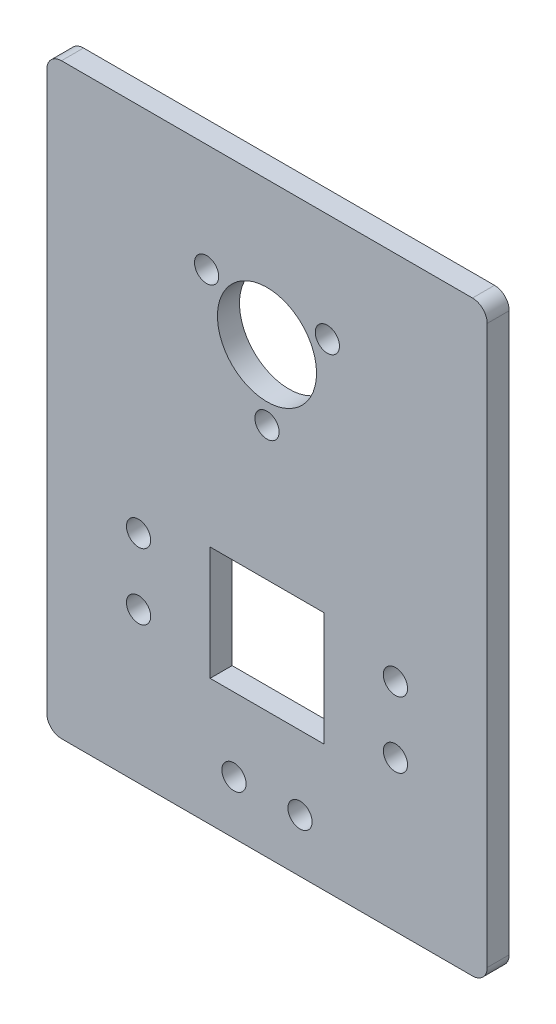
ISO-10303-21;
HEADER;
FILE_DESCRIPTION(('STEP AP214'),'2;1');
FILE_NAME('part.step','',(''),(''),'','','');
FILE_SCHEMA(('AUTOMOTIVE_DESIGN { 1 0 10303 214 1 1 1 1 }'));
ENDSEC;
DATA;
#1=APPLICATION_CONTEXT('core data for automotive mechanical design processes');
#2=APPLICATION_PROTOCOL_DEFINITION('international standard','automotive_design',2000,#1);
#3=PRODUCT_CONTEXT('',#1,'mechanical');
#4=PRODUCT('Part','Part','',(#3));
#5=PRODUCT_RELATED_PRODUCT_CATEGORY('part','',(#4));
#6=PRODUCT_DEFINITION_FORMATION('','',#4);
#7=PRODUCT_DEFINITION_CONTEXT('part definition',#1,'design');
#8=PRODUCT_DEFINITION('design','',#6,#7);
#9=PRODUCT_DEFINITION_SHAPE('','',#8);
#10=(LENGTH_UNIT() NAMED_UNIT(*) SI_UNIT(.MILLI.,.METRE.));
#11=(NAMED_UNIT(*) PLANE_ANGLE_UNIT() SI_UNIT($,.RADIAN.));
#12=(NAMED_UNIT(*) SI_UNIT($,.STERADIAN.) SOLID_ANGLE_UNIT());
#13=UNCERTAINTY_MEASURE_WITH_UNIT(LENGTH_MEASURE(1.E-05),#10,'distance_accuracy_value','');
#14=(GEOMETRIC_REPRESENTATION_CONTEXT(3) GLOBAL_UNCERTAINTY_ASSIGNED_CONTEXT((#13)) GLOBAL_UNIT_ASSIGNED_CONTEXT((#10,
#11,#12)) REPRESENTATION_CONTEXT('',''));
#15=CARTESIAN_POINT('',(0.,0.,0.));
#16=DIRECTION('',(0.,0.,1.));
#17=DIRECTION('',(1.,0.,0.));
#18=AXIS2_PLACEMENT_3D('',#15,#16,#17);
#19=CARTESIAN_POINT('',(0.,0.,3.));
#20=DIRECTION('',(0.,0.,-1.));
#21=DIRECTION('',(-1.,0.,0.));
#22=AXIS2_PLACEMENT_3D('',#19,#20,#21);
#23=PLANE('',#22);
#24=CARTESIAN_POINT('',(17.5,-14.5,3.));
#25=DIRECTION('',(0.,0.,1.));
#26=DIRECTION('',(1.,0.,0.));
#27=AXIS2_PLACEMENT_3D('',#24,#25,#26);
#28=CIRCLE('',#27,1.65);
#29=CARTESIAN_POINT('',(19.15,-14.5,3.));
#30=VERTEX_POINT('',#29);
#31=EDGE_CURVE('E501',#30,#30,#28,.T.);
#32=ORIENTED_EDGE('',*,*,#31,.F.);
#33=EDGE_LOOP('',(#32));
#34=FACE_BOUND('',#33,.T.);
#35=CARTESIAN_POINT('',(-17.5,-5.5,3.));
#36=DIRECTION('',(0.,0.,1.));
#37=DIRECTION('',(1.,0.,0.));
#38=AXIS2_PLACEMENT_3D('',#35,#36,#37);
#39=CIRCLE('',#38,1.65);
#40=CARTESIAN_POINT('',(-15.85,-5.5,3.));
#41=VERTEX_POINT('',#40);
#42=EDGE_CURVE('E505',#41,#41,#39,.T.);
#43=ORIENTED_EDGE('',*,*,#42,.F.);
#44=EDGE_LOOP('',(#43));
#45=FACE_BOUND('',#44,.T.);
#46=CARTESIAN_POINT('',(-17.5,-14.5,3.));
#47=DIRECTION('',(0.,0.,1.));
#48=DIRECTION('',(1.,0.,0.));
#49=AXIS2_PLACEMENT_3D('',#46,#47,#48);
#50=CIRCLE('',#49,1.65);
#51=CARTESIAN_POINT('',(-15.85,-14.5,3.));
#52=VERTEX_POINT('',#51);
#53=EDGE_CURVE('E506',#52,#52,#50,.T.);
#54=ORIENTED_EDGE('',*,*,#53,.F.);
#55=EDGE_LOOP('',(#54));
#56=FACE_BOUND('',#55,.T.);
#57=CARTESIAN_POINT('',(17.5,-5.5,3.));
#58=DIRECTION('',(0.,0.,1.));
#59=DIRECTION('',(1.,0.,0.));
#60=AXIS2_PLACEMENT_3D('',#57,#58,#59);
#61=CIRCLE('',#60,1.65);
#62=CARTESIAN_POINT('',(19.15,-5.5,3.));
#63=VERTEX_POINT('',#62);
#64=EDGE_CURVE('E247',#63,#63,#61,.T.);
#65=ORIENTED_EDGE('',*,*,#64,.F.);
#66=EDGE_LOOP('',(#65));
#67=FACE_BOUND('',#66,.T.);
#68=CARTESIAN_POINT('',(8.22724133595218,30.25,3.));
#69=DIRECTION('',(0.,0.,1.));
#70=DIRECTION('',(1.,0.,0.));
#71=AXIS2_PLACEMENT_3D('',#68,#69,#70);
#72=CIRCLE('',#71,1.65);
#73=CARTESIAN_POINT('',(9.87724133595218,30.25,3.));
#74=VERTEX_POINT('',#73);
#75=EDGE_CURVE('E185',#74,#74,#72,.T.);
#76=ORIENTED_EDGE('',*,*,#75,.F.);
#77=EDGE_LOOP('',(#76));
#78=FACE_BOUND('',#77,.T.);
#79=CARTESIAN_POINT('',(-8.22724133595216,30.25,3.));
#80=DIRECTION('',(0.,0.,1.));
#81=DIRECTION('',(1.,0.,0.));
#82=AXIS2_PLACEMENT_3D('',#79,#80,#81);
#83=CIRCLE('',#82,1.65);
#84=CARTESIAN_POINT('',(-6.57724133595216,30.25,3.));
#85=VERTEX_POINT('',#84);
#86=EDGE_CURVE('E176',#85,#85,#83,.T.);
#87=ORIENTED_EDGE('',*,*,#86,.F.);
#88=EDGE_LOOP('',(#87));
#89=FACE_BOUND('',#88,.T.);
#90=CARTESIAN_POINT('',(0.,16.,3.));
#91=DIRECTION('',(0.,0.,1.));
#92=DIRECTION('',(1.,0.,0.));
#93=AXIS2_PLACEMENT_3D('',#90,#91,#92);
#94=CIRCLE('',#93,1.65);
#95=CARTESIAN_POINT('',(1.65000000000001,16.,3.));
#96=VERTEX_POINT('',#95);
#97=EDGE_CURVE('E173',#96,#96,#94,.T.);
#98=ORIENTED_EDGE('',*,*,#97,.F.);
#99=EDGE_LOOP('',(#98));
#100=FACE_BOUND('',#99,.T.);
#101=DIRECTION('',(-1.,0.,0.));
#102=VECTOR('',#101,1.);
#103=CARTESIAN_POINT('',(-7.75,-2.25,3.));
#104=LINE('',#103,#102);
#105=CARTESIAN_POINT('',(7.75,-2.25,3.));
#106=VERTEX_POINT('',#105);
#107=CARTESIAN_POINT('',(-7.75,-2.25,3.));
#108=VERTEX_POINT('',#107);
#109=EDGE_CURVE('E149',#106,#108,#104,.T.);
#110=ORIENTED_EDGE('',*,*,#109,.F.);
#111=DIRECTION('',(0.,1.,0.));
#112=VECTOR('',#111,1.);
#113=CARTESIAN_POINT('',(7.75,-2.25,3.));
#114=LINE('',#113,#112);
#115=CARTESIAN_POINT('',(7.75,-17.75,3.));
#116=VERTEX_POINT('',#115);
#117=EDGE_CURVE('E154',#116,#106,#114,.T.);
#118=ORIENTED_EDGE('',*,*,#117,.F.);
#119=DIRECTION('',(1.,0.,0.));
#120=VECTOR('',#119,1.);
#121=CARTESIAN_POINT('',(-7.75,-17.75,3.));
#122=LINE('',#121,#120);
#123=CARTESIAN_POINT('',(-7.75,-17.75,3.));
#124=VERTEX_POINT('',#123);
#125=EDGE_CURVE('E158',#124,#116,#122,.T.);
#126=ORIENTED_EDGE('',*,*,#125,.F.);
#127=DIRECTION('',(0.,-1.,0.));
#128=VECTOR('',#127,1.);
#129=CARTESIAN_POINT('',(-7.75,-2.25,3.));
#130=LINE('',#129,#128);
#131=EDGE_CURVE('E138',#108,#124,#130,.T.);
#132=ORIENTED_EDGE('',*,*,#131,.F.);
#133=EDGE_LOOP('',(#110,#118,#126,#132));
#134=FACE_BOUND('',#133,.T.);
#135=CARTESIAN_POINT('',(-4.49999999999999,-27.75,3.));
#136=DIRECTION('',(0.,0.,1.));
#137=DIRECTION('',(1.,0.,0.));
#138=AXIS2_PLACEMENT_3D('',#135,#136,#137);
#139=CIRCLE('',#138,1.65);
#140=CARTESIAN_POINT('',(-2.84999999999999,-27.75,3.));
#141=VERTEX_POINT('',#140);
#142=EDGE_CURVE('E276',#141,#141,#139,.T.);
#143=ORIENTED_EDGE('',*,*,#142,.F.);
#144=EDGE_LOOP('',(#143));
#145=FACE_BOUND('',#144,.T.);
#146=CARTESIAN_POINT('',(4.50000000000001,-27.75,3.));
#147=DIRECTION('',(0.,0.,1.));
#148=DIRECTION('',(1.,0.,0.));
#149=AXIS2_PLACEMENT_3D('',#146,#147,#148);
#150=CIRCLE('',#149,1.65);
#151=CARTESIAN_POINT('',(6.15000000000001,-27.75,3.));
#152=VERTEX_POINT('',#151);
#153=EDGE_CURVE('E271',#152,#152,#150,.T.);
#154=ORIENTED_EDGE('',*,*,#153,.F.);
#155=EDGE_LOOP('',(#154));
#156=FACE_BOUND('',#155,.T.);
#157=CARTESIAN_POINT('',(0.,25.5,3.));
#158=DIRECTION('',(0.,0.,1.));
#159=DIRECTION('',(1.,0.,0.));
#160=AXIS2_PLACEMENT_3D('',#157,#158,#159);
#161=CIRCLE('',#160,6.75);
#162=CARTESIAN_POINT('',(6.75000000000001,25.5,3.));
#163=VERTEX_POINT('',#162);
#164=EDGE_CURVE('E257',#163,#163,#161,.T.);
#165=ORIENTED_EDGE('',*,*,#164,.F.);
#166=EDGE_LOOP('',(#165));
#167=FACE_BOUND('',#166,.T.);
#168=DIRECTION('',(-1.,0.,0.));
#169=VECTOR('',#168,1.);
#170=CARTESIAN_POINT('',(-34.5555340551916,-35.,3.));
#171=LINE('',#170,#169);
#172=CARTESIAN_POINT('',(28.,-35.,3.));
#173=VERTEX_POINT('',#172);
#174=CARTESIAN_POINT('',(-28.,-35.,3.));
#175=VERTEX_POINT('',#174);
#176=EDGE_CURVE('E253',#173,#175,#171,.T.);
#177=ORIENTED_EDGE('',*,*,#176,.F.);
#178=CARTESIAN_POINT('',(28.,-33.,3.));
#179=DIRECTION('',(0.,0.,-1.));
#180=DIRECTION('',(-1.,0.,0.));
#181=AXIS2_PLACEMENT_3D('',#178,#179,#180);
#182=CIRCLE('',#181,2.);
#183=CARTESIAN_POINT('',(30.,-33.,3.));
#184=VERTEX_POINT('',#183);
#185=EDGE_CURVE('E55',#173,#184,#182,.F.);
#186=ORIENTED_EDGE('',*,*,#185,.T.);
#187=DIRECTION('',(0.,1.,0.));
#188=VECTOR('',#187,1.);
#189=CARTESIAN_POINT('',(30.,-45.,3.));
#190=LINE('',#189,#188);
#191=CARTESIAN_POINT('',(30.,43.,3.));
#192=VERTEX_POINT('',#191);
#193=EDGE_CURVE('E190',#184,#192,#190,.T.);
#194=ORIENTED_EDGE('',*,*,#193,.T.);
#195=CARTESIAN_POINT('',(28.,43.,3.));
#196=DIRECTION('',(0.,0.,-1.));
#197=DIRECTION('',(-1.,0.,0.));
#198=AXIS2_PLACEMENT_3D('',#195,#196,#197);
#199=CIRCLE('',#198,2.);
#200=CARTESIAN_POINT('',(28.,45.,3.));
#201=VERTEX_POINT('',#200);
#202=EDGE_CURVE('E222',#192,#201,#199,.F.);
#203=ORIENTED_EDGE('',*,*,#202,.T.);
#204=DIRECTION('',(-1.,0.,0.));
#205=VECTOR('',#204,1.);
#206=CARTESIAN_POINT('',(-30.,45.,3.));
#207=LINE('',#206,#205);
#208=CARTESIAN_POINT('',(-28.,45.,3.));
#209=VERTEX_POINT('',#208);
#210=EDGE_CURVE('E186',#201,#209,#207,.T.);
#211=ORIENTED_EDGE('',*,*,#210,.T.);
#212=CARTESIAN_POINT('',(-28.,43.,3.));
#213=DIRECTION('',(0.,0.,-1.));
#214=DIRECTION('',(-1.,0.,0.));
#215=AXIS2_PLACEMENT_3D('',#212,#213,#214);
#216=CIRCLE('',#215,2.);
#217=CARTESIAN_POINT('',(-30.,43.,3.));
#218=VERTEX_POINT('',#217);
#219=EDGE_CURVE('E221',#209,#218,#216,.F.);
#220=ORIENTED_EDGE('',*,*,#219,.T.);
#221=DIRECTION('',(0.,-1.,0.));
#222=VECTOR('',#221,1.);
#223=CARTESIAN_POINT('',(-30.,-45.,3.));
#224=LINE('',#223,#222);
#225=CARTESIAN_POINT('',(-30.,-33.,3.));
#226=VERTEX_POINT('',#225);
#227=EDGE_CURVE('E192',#218,#226,#224,.T.);
#228=ORIENTED_EDGE('',*,*,#227,.T.);
#229=CARTESIAN_POINT('',(-28.,-33.,3.));
#230=DIRECTION('',(0.,0.,-1.));
#231=DIRECTION('',(-1.,0.,0.));
#232=AXIS2_PLACEMENT_3D('',#229,#230,#231);
#233=CIRCLE('',#232,2.);
#234=EDGE_CURVE('E58',#226,#175,#233,.F.);
#235=ORIENTED_EDGE('',*,*,#234,.T.);
#236=EDGE_LOOP('',(#177,#186,#194,#203,#211,#220,#228,#235));
#237=FACE_BOUND('',#236,.T.);
#238=ADVANCED_FACE('F43',(#34,#45,#56,#67,#78,#89,#100,#134,#145,#156,#167,#237),#23,.F.);
#239=CARTESIAN_POINT('',(30.,-45.,3.));
#240=DIRECTION('',(-1.,0.,0.));
#241=DIRECTION('',(0.,0.,1.));
#242=AXIS2_PLACEMENT_3D('',#239,#240,#241);
#243=PLANE('',#242);
#244=ORIENTED_EDGE('',*,*,#193,.F.);
#245=DIRECTION('',(0.,0.,-1.));
#246=VECTOR('',#245,1.);
#247=CARTESIAN_POINT('',(30.,-33.,3.));
#248=LINE('',#247,#246);
#249=CARTESIAN_POINT('',(30.,-33.,0.));
#250=VERTEX_POINT('',#249);
#251=EDGE_CURVE('E233',#184,#250,#248,.T.);
#252=ORIENTED_EDGE('',*,*,#251,.T.);
#253=DIRECTION('',(0.,1.,0.));
#254=VECTOR('',#253,1.);
#255=CARTESIAN_POINT('',(30.,-45.,0.));
#256=LINE('',#255,#254);
#257=CARTESIAN_POINT('',(30.,43.,0.));
#258=VERTEX_POINT('',#257);
#259=EDGE_CURVE('E175',#250,#258,#256,.T.);
#260=ORIENTED_EDGE('',*,*,#259,.T.);
#261=DIRECTION('',(0.,0.,-1.));
#262=VECTOR('',#261,1.);
#263=CARTESIAN_POINT('',(30.,43.,3.));
#264=LINE('',#263,#262);
#265=EDGE_CURVE('E218',#258,#192,#264,.F.);
#266=ORIENTED_EDGE('',*,*,#265,.T.);
#267=EDGE_LOOP('',(#244,#252,#260,#266));
#268=FACE_BOUND('',#267,.T.);
#269=ADVANCED_FACE('F307',(#268),#243,.F.);
#270=CARTESIAN_POINT('',(-30.,45.,3.));
#271=DIRECTION('',(0.,-1.,0.));
#272=DIRECTION('',(0.,0.,-1.));
#273=AXIS2_PLACEMENT_3D('',#270,#271,#272);
#274=PLANE('',#273);
#275=ORIENTED_EDGE('',*,*,#210,.F.);
#276=DIRECTION('',(0.,0.,-1.));
#277=VECTOR('',#276,1.);
#278=CARTESIAN_POINT('',(28.,45.,3.));
#279=LINE('',#278,#277);
#280=CARTESIAN_POINT('',(28.,45.,0.));
#281=VERTEX_POINT('',#280);
#282=EDGE_CURVE('E208',#201,#281,#279,.T.);
#283=ORIENTED_EDGE('',*,*,#282,.T.);
#284=DIRECTION('',(-1.,0.,0.));
#285=VECTOR('',#284,1.);
#286=CARTESIAN_POINT('',(-30.,45.,0.));
#287=LINE('',#286,#285);
#288=CARTESIAN_POINT('',(-28.,45.,0.));
#289=VERTEX_POINT('',#288);
#290=EDGE_CURVE('E200',#281,#289,#287,.T.);
#291=ORIENTED_EDGE('',*,*,#290,.T.);
#292=DIRECTION('',(0.,0.,-1.));
#293=VECTOR('',#292,1.);
#294=CARTESIAN_POINT('',(-28.,45.,3.));
#295=LINE('',#294,#293);
#296=EDGE_CURVE('E206',#289,#209,#295,.F.);
#297=ORIENTED_EDGE('',*,*,#296,.T.);
#298=EDGE_LOOP('',(#275,#283,#291,#297));
#299=FACE_BOUND('',#298,.T.);
#300=ADVANCED_FACE('F331',(#299),#274,.F.);
#301=CARTESIAN_POINT('',(-30.,-45.,3.));
#302=DIRECTION('',(1.,0.,0.));
#303=DIRECTION('',(0.,0.,-1.));
#304=AXIS2_PLACEMENT_3D('',#301,#302,#303);
#305=PLANE('',#304);
#306=DIRECTION('',(0.,-1.,0.));
#307=VECTOR('',#306,1.);
#308=CARTESIAN_POINT('',(-30.,-45.,0.));
#309=LINE('',#308,#307);
#310=CARTESIAN_POINT('',(-30.,43.,0.));
#311=VERTEX_POINT('',#310);
#312=CARTESIAN_POINT('',(-30.,-33.,0.));
#313=VERTEX_POINT('',#312);
#314=EDGE_CURVE('E188',#311,#313,#309,.T.);
#315=ORIENTED_EDGE('',*,*,#314,.T.);
#316=DIRECTION('',(0.,0.,1.));
#317=VECTOR('',#316,1.);
#318=CARTESIAN_POINT('',(-30.,-33.,3.));
#319=LINE('',#318,#317);
#320=EDGE_CURVE('E11',#313,#226,#319,.T.);
#321=ORIENTED_EDGE('',*,*,#320,.T.);
#322=ORIENTED_EDGE('',*,*,#227,.F.);
#323=DIRECTION('',(0.,0.,-1.));
#324=VECTOR('',#323,1.);
#325=CARTESIAN_POINT('',(-30.,43.,3.));
#326=LINE('',#325,#324);
#327=EDGE_CURVE('E224',#218,#311,#326,.T.);
#328=ORIENTED_EDGE('',*,*,#327,.T.);
#329=EDGE_LOOP('',(#315,#321,#322,#328));
#330=FACE_BOUND('',#329,.T.);
#331=ADVANCED_FACE('F292',(#330),#305,.F.);
#332=CARTESIAN_POINT('',(0.,0.,0.));
#333=DIRECTION('',(0.,0.,-1.));
#334=DIRECTION('',(-1.,0.,0.));
#335=AXIS2_PLACEMENT_3D('',#332,#333,#334);
#336=PLANE('',#335);
#337=CARTESIAN_POINT('',(17.5,-14.5,0.));
#338=DIRECTION('',(0.,0.,-1.));
#339=DIRECTION('',(-1.,0.,0.));
#340=AXIS2_PLACEMENT_3D('',#337,#338,#339);
#341=CIRCLE('',#340,1.65);
#342=CARTESIAN_POINT('',(15.85,-14.5,0.));
#343=VERTEX_POINT('',#342);
#344=EDGE_CURVE('E50',#343,#343,#341,.T.);
#345=ORIENTED_EDGE('',*,*,#344,.F.);
#346=EDGE_LOOP('',(#345));
#347=FACE_BOUND('',#346,.T.);
#348=CARTESIAN_POINT('',(-17.5,-5.5,0.));
#349=DIRECTION('',(0.,0.,-1.));
#350=DIRECTION('',(-1.,0.,0.));
#351=AXIS2_PLACEMENT_3D('',#348,#349,#350);
#352=CIRCLE('',#351,1.65);
#353=CARTESIAN_POINT('',(-19.15,-5.5,0.));
#354=VERTEX_POINT('',#353);
#355=EDGE_CURVE('E249',#354,#354,#352,.T.);
#356=ORIENTED_EDGE('',*,*,#355,.F.);
#357=EDGE_LOOP('',(#356));
#358=FACE_BOUND('',#357,.T.);
#359=CARTESIAN_POINT('',(-17.5,-14.5,0.));
#360=DIRECTION('',(0.,0.,-1.));
#361=DIRECTION('',(-1.,0.,0.));
#362=AXIS2_PLACEMENT_3D('',#359,#360,#361);
#363=CIRCLE('',#362,1.65);
#364=CARTESIAN_POINT('',(-19.15,-14.5,0.));
#365=VERTEX_POINT('',#364);
#366=EDGE_CURVE('E250',#365,#365,#363,.T.);
#367=ORIENTED_EDGE('',*,*,#366,.F.);
#368=EDGE_LOOP('',(#367));
#369=FACE_BOUND('',#368,.T.);
#370=CARTESIAN_POINT('',(17.5,-5.5,0.));
#371=DIRECTION('',(0.,0.,-1.));
#372=DIRECTION('',(-1.,0.,0.));
#373=AXIS2_PLACEMENT_3D('',#370,#371,#372);
#374=CIRCLE('',#373,1.65);
#375=CARTESIAN_POINT('',(15.85,-5.5,0.));
#376=VERTEX_POINT('',#375);
#377=EDGE_CURVE('E242',#376,#376,#374,.T.);
#378=ORIENTED_EDGE('',*,*,#377,.F.);
#379=EDGE_LOOP('',(#378));
#380=FACE_BOUND('',#379,.T.);
#381=ORIENTED_EDGE('',*,*,#259,.F.);
#382=CARTESIAN_POINT('',(28.,-33.,0.));
#383=DIRECTION('',(0.,0.,-1.));
#384=DIRECTION('',(-1.,0.,0.));
#385=AXIS2_PLACEMENT_3D('',#382,#383,#384);
#386=CIRCLE('',#385,2.);
#387=CARTESIAN_POINT('',(28.,-35.,0.));
#388=VERTEX_POINT('',#387);
#389=EDGE_CURVE('E236',#250,#388,#386,.T.);
#390=ORIENTED_EDGE('',*,*,#389,.T.);
#391=DIRECTION('',(1.,0.,0.));
#392=VECTOR('',#391,1.);
#393=CARTESIAN_POINT('',(0.,-35.,0.));
#394=LINE('',#393,#392);
#395=CARTESIAN_POINT('',(-28.,-35.,0.));
#396=VERTEX_POINT('',#395);
#397=EDGE_CURVE('E226',#396,#388,#394,.T.);
#398=ORIENTED_EDGE('',*,*,#397,.F.);
#399=CARTESIAN_POINT('',(-28.,-33.,0.));
#400=DIRECTION('',(0.,0.,-1.));
#401=DIRECTION('',(-1.,0.,0.));
#402=AXIS2_PLACEMENT_3D('',#399,#400,#401);
#403=CIRCLE('',#402,2.);
#404=EDGE_CURVE('E234',#396,#313,#403,.T.);
#405=ORIENTED_EDGE('',*,*,#404,.T.);
#406=ORIENTED_EDGE('',*,*,#314,.F.);
#407=CARTESIAN_POINT('',(-28.,43.,0.));
#408=DIRECTION('',(0.,0.,-1.));
#409=DIRECTION('',(-1.,0.,0.));
#410=AXIS2_PLACEMENT_3D('',#407,#408,#409);
#411=CIRCLE('',#410,2.);
#412=EDGE_CURVE('E212',#311,#289,#411,.T.);
#413=ORIENTED_EDGE('',*,*,#412,.T.);
#414=ORIENTED_EDGE('',*,*,#290,.F.);
#415=CARTESIAN_POINT('',(28.,43.,0.));
#416=DIRECTION('',(0.,0.,-1.));
#417=DIRECTION('',(-1.,0.,0.));
#418=AXIS2_PLACEMENT_3D('',#415,#416,#417);
#419=CIRCLE('',#418,2.);
#420=EDGE_CURVE('E214',#281,#258,#419,.T.);
#421=ORIENTED_EDGE('',*,*,#420,.T.);
#422=EDGE_LOOP('',(#381,#390,#398,#405,#406,#413,#414,#421));
#423=FACE_BOUND('',#422,.T.);
#424=CARTESIAN_POINT('',(0.,25.5,0.));
#425=DIRECTION('',(0.,0.,1.));
#426=DIRECTION('',(1.,0.,0.));
#427=AXIS2_PLACEMENT_3D('',#424,#425,#426);
#428=CIRCLE('',#427,6.75);
#429=CARTESIAN_POINT('',(6.75000000000001,25.5,0.));
#430=VERTEX_POINT('',#429);
#431=EDGE_CURVE('E265',#430,#430,#428,.T.);
#432=ORIENTED_EDGE('',*,*,#431,.T.);
#433=EDGE_LOOP('',(#432));
#434=FACE_BOUND('',#433,.T.);
#435=CARTESIAN_POINT('',(4.50000000000001,-27.75,0.));
#436=DIRECTION('',(0.,0.,1.));
#437=DIRECTION('',(1.,0.,0.));
#438=AXIS2_PLACEMENT_3D('',#435,#436,#437);
#439=CIRCLE('',#438,1.65);
#440=CARTESIAN_POINT('',(6.15000000000001,-27.75,0.));
#441=VERTEX_POINT('',#440);
#442=EDGE_CURVE('E269',#441,#441,#439,.T.);
#443=ORIENTED_EDGE('',*,*,#442,.T.);
#444=EDGE_LOOP('',(#443));
#445=FACE_BOUND('',#444,.T.);
#446=CARTESIAN_POINT('',(-4.49999999999999,-27.75,0.));
#447=DIRECTION('',(0.,0.,1.));
#448=DIRECTION('',(1.,0.,0.));
#449=AXIS2_PLACEMENT_3D('',#446,#447,#448);
#450=CIRCLE('',#449,1.65);
#451=CARTESIAN_POINT('',(-2.84999999999999,-27.75,0.));
#452=VERTEX_POINT('',#451);
#453=EDGE_CURVE('E267',#452,#452,#450,.T.);
#454=ORIENTED_EDGE('',*,*,#453,.T.);
#455=EDGE_LOOP('',(#454));
#456=FACE_BOUND('',#455,.T.);
#457=DIRECTION('',(0.,-1.,0.));
#458=VECTOR('',#457,1.);
#459=CARTESIAN_POINT('',(7.75,0.,0.));
#460=LINE('',#459,#458);
#461=CARTESIAN_POINT('',(7.75,-2.25,0.));
#462=VERTEX_POINT('',#461);
#463=CARTESIAN_POINT('',(7.75,-17.75,0.));
#464=VERTEX_POINT('',#463);
#465=EDGE_CURVE('E207',#462,#464,#460,.T.);
#466=ORIENTED_EDGE('',*,*,#465,.F.);
#467=DIRECTION('',(1.,0.,0.));
#468=VECTOR('',#467,1.);
#469=CARTESIAN_POINT('',(0.,-2.25,0.));
#470=LINE('',#469,#468);
#471=CARTESIAN_POINT('',(-7.75,-2.25,0.));
#472=VERTEX_POINT('',#471);
#473=EDGE_CURVE('E194',#472,#462,#470,.T.);
#474=ORIENTED_EDGE('',*,*,#473,.F.);
#475=DIRECTION('',(0.,1.,0.));
#476=VECTOR('',#475,1.);
#477=CARTESIAN_POINT('',(-7.75,0.,0.));
#478=LINE('',#477,#476);
#479=CARTESIAN_POINT('',(-7.75,-17.75,0.));
#480=VERTEX_POINT('',#479);
#481=EDGE_CURVE('E145',#480,#472,#478,.T.);
#482=ORIENTED_EDGE('',*,*,#481,.F.);
#483=DIRECTION('',(-1.,0.,0.));
#484=VECTOR('',#483,1.);
#485=CARTESIAN_POINT('',(0.,-17.75,0.));
#486=LINE('',#485,#484);
#487=EDGE_CURVE('E203',#464,#480,#486,.T.);
#488=ORIENTED_EDGE('',*,*,#487,.F.);
#489=EDGE_LOOP('',(#466,#474,#482,#488));
#490=FACE_BOUND('',#489,.T.);
#491=CARTESIAN_POINT('',(0.,16.,0.));
#492=DIRECTION('',(0.,0.,1.));
#493=DIRECTION('',(1.,0.,0.));
#494=AXIS2_PLACEMENT_3D('',#491,#492,#493);
#495=CIRCLE('',#494,1.65);
#496=CARTESIAN_POINT('',(1.65000000000001,16.,0.));
#497=VERTEX_POINT('',#496);
#498=EDGE_CURVE('E169',#497,#497,#495,.T.);
#499=ORIENTED_EDGE('',*,*,#498,.T.);
#500=EDGE_LOOP('',(#499));
#501=FACE_BOUND('',#500,.T.);
#502=CARTESIAN_POINT('',(-8.22724133595216,30.25,0.));
#503=DIRECTION('',(0.,0.,1.));
#504=DIRECTION('',(1.,0.,0.));
#505=AXIS2_PLACEMENT_3D('',#502,#503,#504);
#506=CIRCLE('',#505,1.65);
#507=CARTESIAN_POINT('',(-6.57724133595216,30.25,0.));
#508=VERTEX_POINT('',#507);
#509=EDGE_CURVE('E177',#508,#508,#506,.T.);
#510=ORIENTED_EDGE('',*,*,#509,.T.);
#511=EDGE_LOOP('',(#510));
#512=FACE_BOUND('',#511,.T.);
#513=CARTESIAN_POINT('',(8.22724133595218,30.25,0.));
#514=DIRECTION('',(0.,0.,1.));
#515=DIRECTION('',(1.,0.,0.));
#516=AXIS2_PLACEMENT_3D('',#513,#514,#515);
#517=CIRCLE('',#516,1.65);
#518=CARTESIAN_POINT('',(9.87724133595218,30.25,0.));
#519=VERTEX_POINT('',#518);
#520=EDGE_CURVE('E168',#519,#519,#517,.T.);
#521=ORIENTED_EDGE('',*,*,#520,.T.);
#522=EDGE_LOOP('',(#521));
#523=FACE_BOUND('',#522,.T.);
#524=ADVANCED_FACE('F287',(#347,#358,#369,#380,#423,#434,#445,#456,#490,#501,#512,#523),#336,.T.);
#525=CARTESIAN_POINT('',(8.22724133595218,30.25,0.));
#526=DIRECTION('',(0.,0.,1.));
#527=DIRECTION('',(1.,0.,0.));
#528=AXIS2_PLACEMENT_3D('',#525,#526,#527);
#529=CYLINDRICAL_SURFACE('',#528,1.65);
#530=ORIENTED_EDGE('',*,*,#520,.F.);
#531=EDGE_LOOP('',(#530));
#532=FACE_BOUND('',#531,.T.);
#533=ORIENTED_EDGE('',*,*,#75,.T.);
#534=EDGE_LOOP('',(#533));
#535=FACE_BOUND('',#534,.T.);
#536=ADVANCED_FACE('F293',(#532,#535),#529,.F.);
#537=CARTESIAN_POINT('',(-8.22724133595216,30.25,0.));
#538=DIRECTION('',(0.,0.,1.));
#539=DIRECTION('',(1.,0.,0.));
#540=AXIS2_PLACEMENT_3D('',#537,#538,#539);
#541=CYLINDRICAL_SURFACE('',#540,1.65);
#542=ORIENTED_EDGE('',*,*,#509,.F.);
#543=EDGE_LOOP('',(#542));
#544=FACE_BOUND('',#543,.T.);
#545=ORIENTED_EDGE('',*,*,#86,.T.);
#546=EDGE_LOOP('',(#545));
#547=FACE_BOUND('',#546,.T.);
#548=ADVANCED_FACE('F303',(#544,#547),#541,.F.);
#549=CARTESIAN_POINT('',(0.,16.,0.));
#550=DIRECTION('',(0.,0.,1.));
#551=DIRECTION('',(1.,0.,0.));
#552=AXIS2_PLACEMENT_3D('',#549,#550,#551);
#553=CYLINDRICAL_SURFACE('',#552,1.65);
#554=ORIENTED_EDGE('',*,*,#498,.F.);
#555=EDGE_LOOP('',(#554));
#556=FACE_BOUND('',#555,.T.);
#557=ORIENTED_EDGE('',*,*,#97,.T.);
#558=EDGE_LOOP('',(#557));
#559=FACE_BOUND('',#558,.T.);
#560=ADVANCED_FACE('F317',(#556,#559),#553,.F.);
#561=CARTESIAN_POINT('',(7.75,-2.25,-997.));
#562=DIRECTION('',(1.,0.,0.));
#563=DIRECTION('',(0.,1.,0.));
#564=AXIS2_PLACEMENT_3D('',#561,#562,#563);
#565=PLANE('',#564);
#566=ORIENTED_EDGE('',*,*,#465,.T.);
#567=DIRECTION('',(0.,0.,1.));
#568=VECTOR('',#567,1.);
#569=CARTESIAN_POINT('',(7.75,-17.75,-997.));
#570=LINE('',#569,#568);
#571=EDGE_CURVE('E165',#464,#116,#570,.T.);
#572=ORIENTED_EDGE('',*,*,#571,.T.);
#573=ORIENTED_EDGE('',*,*,#117,.T.);
#574=DIRECTION('',(0.,0.,1.));
#575=VECTOR('',#574,1.);
#576=CARTESIAN_POINT('',(7.75,-2.25,-997.));
#577=LINE('',#576,#575);
#578=EDGE_CURVE('E146',#462,#106,#577,.T.);
#579=ORIENTED_EDGE('',*,*,#578,.F.);
#580=EDGE_LOOP('',(#566,#572,#573,#579));
#581=FACE_BOUND('',#580,.T.);
#582=ADVANCED_FACE('F281',(#581),#565,.F.);
#583=CARTESIAN_POINT('',(-7.75,-17.75,-997.));
#584=DIRECTION('',(0.,-1.,0.));
#585=DIRECTION('',(0.,0.,-1.));
#586=AXIS2_PLACEMENT_3D('',#583,#584,#585);
#587=PLANE('',#586);
#588=ORIENTED_EDGE('',*,*,#487,.T.);
#589=DIRECTION('',(0.,0.,1.));
#590=VECTOR('',#589,1.);
#591=CARTESIAN_POINT('',(-7.75,-17.75,-997.));
#592=LINE('',#591,#590);
#593=EDGE_CURVE('E143',#480,#124,#592,.T.);
#594=ORIENTED_EDGE('',*,*,#593,.T.);
#595=ORIENTED_EDGE('',*,*,#125,.T.);
#596=ORIENTED_EDGE('',*,*,#571,.F.);
#597=EDGE_LOOP('',(#588,#594,#595,#596));
#598=FACE_BOUND('',#597,.T.);
#599=ADVANCED_FACE('F286',(#598),#587,.F.);
#600=CARTESIAN_POINT('',(-7.75,-2.25,-997.));
#601=DIRECTION('',(-1.,0.,0.));
#602=DIRECTION('',(0.,-1.,0.));
#603=AXIS2_PLACEMENT_3D('',#600,#601,#602);
#604=PLANE('',#603);
#605=ORIENTED_EDGE('',*,*,#481,.T.);
#606=DIRECTION('',(0.,0.,1.));
#607=VECTOR('',#606,1.);
#608=CARTESIAN_POINT('',(-7.75,-2.25,-997.));
#609=LINE('',#608,#607);
#610=EDGE_CURVE('E132',#472,#108,#609,.T.);
#611=ORIENTED_EDGE('',*,*,#610,.T.);
#612=ORIENTED_EDGE('',*,*,#131,.T.);
#613=ORIENTED_EDGE('',*,*,#593,.F.);
#614=EDGE_LOOP('',(#605,#611,#612,#613));
#615=FACE_BOUND('',#614,.T.);
#616=ADVANCED_FACE('F136',(#615),#604,.F.);
#617=CARTESIAN_POINT('',(-7.75,-2.25,-997.));
#618=DIRECTION('',(0.,1.,0.));
#619=DIRECTION('',(0.,0.,1.));
#620=AXIS2_PLACEMENT_3D('',#617,#618,#619);
#621=PLANE('',#620);
#622=ORIENTED_EDGE('',*,*,#473,.T.);
#623=ORIENTED_EDGE('',*,*,#578,.T.);
#624=ORIENTED_EDGE('',*,*,#109,.T.);
#625=ORIENTED_EDGE('',*,*,#610,.F.);
#626=EDGE_LOOP('',(#622,#623,#624,#625));
#627=FACE_BOUND('',#626,.T.);
#628=ADVANCED_FACE('F151',(#627),#621,.F.);
#629=CARTESIAN_POINT('',(-4.49999999999999,-27.75,0.));
#630=DIRECTION('',(0.,0.,1.));
#631=DIRECTION('',(1.,0.,0.));
#632=AXIS2_PLACEMENT_3D('',#629,#630,#631);
#633=CYLINDRICAL_SURFACE('',#632,1.65);
#634=ORIENTED_EDGE('',*,*,#453,.F.);
#635=EDGE_LOOP('',(#634));
#636=FACE_BOUND('',#635,.T.);
#637=ORIENTED_EDGE('',*,*,#142,.T.);
#638=EDGE_LOOP('',(#637));
#639=FACE_BOUND('',#638,.T.);
#640=ADVANCED_FACE('F385',(#636,#639),#633,.F.);
#641=CARTESIAN_POINT('',(4.50000000000001,-27.75,0.));
#642=DIRECTION('',(0.,0.,1.));
#643=DIRECTION('',(1.,0.,0.));
#644=AXIS2_PLACEMENT_3D('',#641,#642,#643);
#645=CYLINDRICAL_SURFACE('',#644,1.65);
#646=ORIENTED_EDGE('',*,*,#442,.F.);
#647=EDGE_LOOP('',(#646));
#648=FACE_BOUND('',#647,.T.);
#649=ORIENTED_EDGE('',*,*,#153,.T.);
#650=EDGE_LOOP('',(#649));
#651=FACE_BOUND('',#650,.T.);
#652=ADVANCED_FACE('F383',(#648,#651),#645,.F.);
#653=CARTESIAN_POINT('',(0.,25.5,0.));
#654=DIRECTION('',(0.,0.,1.));
#655=DIRECTION('',(1.,0.,0.));
#656=AXIS2_PLACEMENT_3D('',#653,#654,#655);
#657=CYLINDRICAL_SURFACE('',#656,6.75);
#658=ORIENTED_EDGE('',*,*,#431,.F.);
#659=EDGE_LOOP('',(#658));
#660=FACE_BOUND('',#659,.T.);
#661=ORIENTED_EDGE('',*,*,#164,.T.);
#662=EDGE_LOOP('',(#661));
#663=FACE_BOUND('',#662,.T.);
#664=ADVANCED_FACE('F342',(#660,#663),#657,.F.);
#665=CARTESIAN_POINT('',(28.,43.,3.));
#666=DIRECTION('',(0.,0.,-1.));
#667=DIRECTION('',(-1.,0.,0.));
#668=AXIS2_PLACEMENT_3D('',#665,#666,#667);
#669=CYLINDRICAL_SURFACE('',#668,2.);
#670=ORIENTED_EDGE('',*,*,#202,.F.);
#671=ORIENTED_EDGE('',*,*,#265,.F.);
#672=ORIENTED_EDGE('',*,*,#420,.F.);
#673=ORIENTED_EDGE('',*,*,#282,.F.);
#674=EDGE_LOOP('',(#670,#671,#672,#673));
#675=FACE_BOUND('',#674,.T.);
#676=ADVANCED_FACE('F339',(#675),#669,.T.);
#677=CARTESIAN_POINT('',(-28.,43.,3.));
#678=DIRECTION('',(0.,0.,-1.));
#679=DIRECTION('',(-1.,0.,0.));
#680=AXIS2_PLACEMENT_3D('',#677,#678,#679);
#681=CYLINDRICAL_SURFACE('',#680,2.);
#682=ORIENTED_EDGE('',*,*,#219,.F.);
#683=ORIENTED_EDGE('',*,*,#296,.F.);
#684=ORIENTED_EDGE('',*,*,#412,.F.);
#685=ORIENTED_EDGE('',*,*,#327,.F.);
#686=EDGE_LOOP('',(#682,#683,#684,#685));
#687=FACE_BOUND('',#686,.T.);
#688=ADVANCED_FACE('F345',(#687),#681,.T.);
#689=CARTESIAN_POINT('',(-34.5555340551916,-35.,-997.));
#690=DIRECTION('',(0.,1.,0.));
#691=DIRECTION('',(0.,0.,1.));
#692=AXIS2_PLACEMENT_3D('',#689,#690,#691);
#693=PLANE('',#692);
#694=ORIENTED_EDGE('',*,*,#397,.T.);
#695=DIRECTION('',(0.,0.,-1.));
#696=VECTOR('',#695,1.);
#697=CARTESIAN_POINT('',(28.,-35.,-997.));
#698=LINE('',#697,#696);
#699=EDGE_CURVE('E239',#388,#173,#698,.F.);
#700=ORIENTED_EDGE('',*,*,#699,.T.);
#701=ORIENTED_EDGE('',*,*,#176,.T.);
#702=DIRECTION('',(0.,0.,1.));
#703=VECTOR('',#702,1.);
#704=CARTESIAN_POINT('',(-28.,-35.,-997.));
#705=LINE('',#704,#703);
#706=EDGE_CURVE('E238',#175,#396,#705,.F.);
#707=ORIENTED_EDGE('',*,*,#706,.T.);
#708=EDGE_LOOP('',(#694,#700,#701,#707));
#709=FACE_BOUND('',#708,.T.);
#710=ADVANCED_FACE('F346',(#709),#693,.F.);
#711=CARTESIAN_POINT('',(28.,-33.,3.));
#712=DIRECTION('',(0.,0.,-1.));
#713=DIRECTION('',(-1.,0.,0.));
#714=AXIS2_PLACEMENT_3D('',#711,#712,#713);
#715=CYLINDRICAL_SURFACE('',#714,2.);
#716=ORIENTED_EDGE('',*,*,#185,.F.);
#717=ORIENTED_EDGE('',*,*,#699,.F.);
#718=ORIENTED_EDGE('',*,*,#389,.F.);
#719=ORIENTED_EDGE('',*,*,#251,.F.);
#720=EDGE_LOOP('',(#716,#717,#718,#719));
#721=FACE_BOUND('',#720,.T.);
#722=ADVANCED_FACE('F348',(#721),#715,.T.);
#723=CARTESIAN_POINT('',(-28.,-33.,3.));
#724=DIRECTION('',(0.,0.,1.));
#725=DIRECTION('',(1.,0.,0.));
#726=AXIS2_PLACEMENT_3D('',#723,#724,#725);
#727=CYLINDRICAL_SURFACE('',#726,2.);
#728=ORIENTED_EDGE('',*,*,#404,.F.);
#729=ORIENTED_EDGE('',*,*,#706,.F.);
#730=ORIENTED_EDGE('',*,*,#234,.F.);
#731=ORIENTED_EDGE('',*,*,#320,.F.);
#732=EDGE_LOOP('',(#728,#729,#730,#731));
#733=FACE_BOUND('',#732,.T.);
#734=ADVANCED_FACE('F44',(#733),#727,.T.);
#735=CARTESIAN_POINT('',(17.5,-5.5,-997.));
#736=DIRECTION('',(0.,0.,1.));
#737=DIRECTION('',(1.,0.,0.));
#738=AXIS2_PLACEMENT_3D('',#735,#736,#737);
#739=CYLINDRICAL_SURFACE('',#738,1.65);
#740=ORIENTED_EDGE('',*,*,#377,.T.);
#741=EDGE_LOOP('',(#740));
#742=FACE_BOUND('',#741,.T.);
#743=ORIENTED_EDGE('',*,*,#64,.T.);
#744=EDGE_LOOP('',(#743));
#745=FACE_BOUND('',#744,.T.);
#746=ADVANCED_FACE('F354',(#742,#745),#739,.F.);
#747=CARTESIAN_POINT('',(-17.5,-14.5,-997.));
#748=DIRECTION('',(0.,0.,1.));
#749=DIRECTION('',(1.,0.,0.));
#750=AXIS2_PLACEMENT_3D('',#747,#748,#749);
#751=CYLINDRICAL_SURFACE('',#750,1.65);
#752=ORIENTED_EDGE('',*,*,#366,.T.);
#753=EDGE_LOOP('',(#752));
#754=FACE_BOUND('',#753,.T.);
#755=ORIENTED_EDGE('',*,*,#53,.T.);
#756=EDGE_LOOP('',(#755));
#757=FACE_BOUND('',#756,.T.);
#758=ADVANCED_FACE('F466',(#754,#757),#751,.F.);
#759=CARTESIAN_POINT('',(-17.5,-5.5,-997.));
#760=DIRECTION('',(0.,0.,1.));
#761=DIRECTION('',(1.,0.,0.));
#762=AXIS2_PLACEMENT_3D('',#759,#760,#761);
#763=CYLINDRICAL_SURFACE('',#762,1.65);
#764=ORIENTED_EDGE('',*,*,#355,.T.);
#765=EDGE_LOOP('',(#764));
#766=FACE_BOUND('',#765,.T.);
#767=ORIENTED_EDGE('',*,*,#42,.T.);
#768=EDGE_LOOP('',(#767));
#769=FACE_BOUND('',#768,.T.);
#770=ADVANCED_FACE('F480',(#766,#769),#763,.F.);
#771=CARTESIAN_POINT('',(17.5,-14.5,-997.));
#772=DIRECTION('',(0.,0.,1.));
#773=DIRECTION('',(1.,0.,0.));
#774=AXIS2_PLACEMENT_3D('',#771,#772,#773);
#775=CYLINDRICAL_SURFACE('',#774,1.65);
#776=ORIENTED_EDGE('',*,*,#344,.T.);
#777=EDGE_LOOP('',(#776));
#778=FACE_BOUND('',#777,.T.);
#779=ORIENTED_EDGE('',*,*,#31,.T.);
#780=EDGE_LOOP('',(#779));
#781=FACE_BOUND('',#780,.T.);
#782=ADVANCED_FACE('F487',(#778,#781),#775,.F.);
#783=CLOSED_SHELL('',(#238,#269,#300,#331,#524,#536,#548,#560,#582,#599,#616,#628,#640,#652,
#664,#676,#688,#710,#722,#734,#746,#758,#770,#782));
#784=MANIFOLD_SOLID_BREP('B2',#783);
#785=ADVANCED_BREP_SHAPE_REPRESENTATION('',(#18,#784),#14);
#786=SHAPE_DEFINITION_REPRESENTATION(#9,#785);
ENDSEC;
END-ISO-10303-21;
